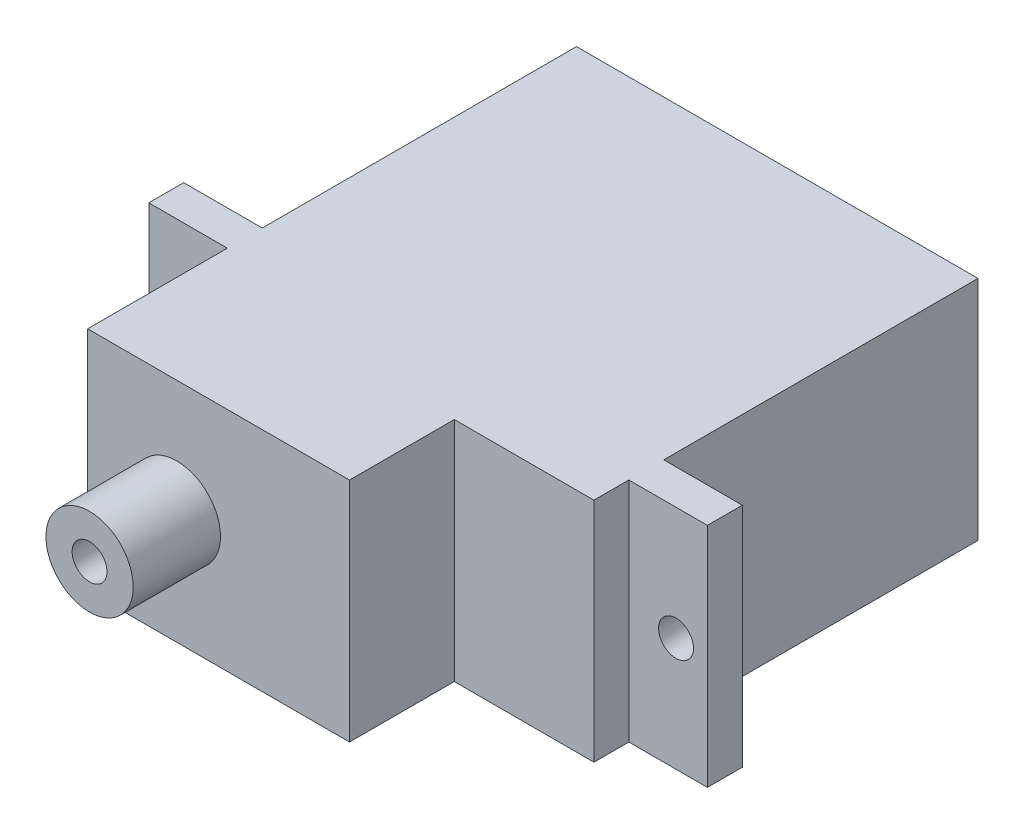
ISO-10303-21;
HEADER;
FILE_DESCRIPTION(('STEP AP214'),'2;1');
FILE_NAME('part.step','',(''),(''),'','','');
FILE_SCHEMA(('AUTOMOTIVE_DESIGN { 1 0 10303 214 1 1 1 1 }'));
ENDSEC;
DATA;
#1=APPLICATION_CONTEXT('core data for automotive mechanical design processes');
#2=APPLICATION_PROTOCOL_DEFINITION('international standard','automotive_design',2000,#1);
#3=PRODUCT_CONTEXT('',#1,'mechanical');
#4=PRODUCT('Part','Part','',(#3));
#5=PRODUCT_RELATED_PRODUCT_CATEGORY('part','',(#4));
#6=PRODUCT_DEFINITION_FORMATION('','',#4);
#7=PRODUCT_DEFINITION_CONTEXT('part definition',#1,'design');
#8=PRODUCT_DEFINITION('design','',#6,#7);
#9=PRODUCT_DEFINITION_SHAPE('','',#8);
#10=(LENGTH_UNIT() NAMED_UNIT(*) SI_UNIT(.MILLI.,.METRE.));
#11=(NAMED_UNIT(*) PLANE_ANGLE_UNIT() SI_UNIT($,.RADIAN.));
#12=(NAMED_UNIT(*) SI_UNIT($,.STERADIAN.) SOLID_ANGLE_UNIT());
#13=UNCERTAINTY_MEASURE_WITH_UNIT(LENGTH_MEASURE(1.E-05),#10,'distance_accuracy_value','');
#14=(GEOMETRIC_REPRESENTATION_CONTEXT(3) GLOBAL_UNCERTAINTY_ASSIGNED_CONTEXT((#13)) GLOBAL_UNIT_ASSIGNED_CONTEXT((#10,
#11,#12)) REPRESENTATION_CONTEXT('',''));
#15=CARTESIAN_POINT('',(0.,0.,0.));
#16=DIRECTION('',(0.,0.,1.));
#17=DIRECTION('',(1.,0.,0.));
#18=AXIS2_PLACEMENT_3D('',#15,#16,#17);
#19=CARTESIAN_POINT('',(0.,0.,20.));
#20=DIRECTION('',(0.,0.,1.));
#21=DIRECTION('',(1.,0.,0.));
#22=AXIS2_PLACEMENT_3D('',#19,#20,#21);
#23=PLANE('',#22);
#24=CARTESIAN_POINT('',(14.2018791837017,0.,20.));
#25=DIRECTION('',(0.,0.,1.));
#26=DIRECTION('',(1.,0.,0.));
#27=AXIS2_PLACEMENT_3D('',#24,#25,#26);
#28=CIRCLE('',#27,1.);
#29=CARTESIAN_POINT('',(15.2018791837017,0.,20.));
#30=VERTEX_POINT('',#29);
#31=EDGE_CURVE('E312',#30,#30,#28,.T.);
#32=ORIENTED_EDGE('',*,*,#31,.F.);
#33=EDGE_LOOP('',(#32));
#34=FACE_BOUND('',#33,.T.);
#35=DIRECTION('',(0.,1.,0.));
#36=VECTOR('',#35,1.);
#37=CARTESIAN_POINT('',(11.5,6.5,20.));
#38=LINE('',#37,#36);
#39=CARTESIAN_POINT('',(11.5,-6.5,20.));
#40=VERTEX_POINT('',#39);
#41=CARTESIAN_POINT('',(11.5,6.5,20.));
#42=VERTEX_POINT('',#41);
#43=EDGE_CURVE('E59',#40,#42,#38,.T.);
#44=ORIENTED_EDGE('',*,*,#43,.F.);
#45=DIRECTION('',(1.,0.,0.));
#46=VECTOR('',#45,1.);
#47=CARTESIAN_POINT('',(-16.,-6.5,20.));
#48=LINE('',#47,#46);
#49=CARTESIAN_POINT('',(16.,-6.5,20.));
#50=VERTEX_POINT('',#49);
#51=EDGE_CURVE('E199',#40,#50,#48,.T.);
#52=ORIENTED_EDGE('',*,*,#51,.T.);
#53=DIRECTION('',(0.,1.,0.));
#54=VECTOR('',#53,1.);
#55=CARTESIAN_POINT('',(16.,6.5,20.));
#56=LINE('',#55,#54);
#57=CARTESIAN_POINT('',(16.,6.5,20.));
#58=VERTEX_POINT('',#57);
#59=EDGE_CURVE('E190',#50,#58,#56,.T.);
#60=ORIENTED_EDGE('',*,*,#59,.T.);
#61=DIRECTION('',(-1.,0.,0.));
#62=VECTOR('',#61,1.);
#63=CARTESIAN_POINT('',(-16.,6.5,20.));
#64=LINE('',#63,#62);
#65=EDGE_CURVE('E195',#58,#42,#64,.T.);
#66=ORIENTED_EDGE('',*,*,#65,.T.);
#67=EDGE_LOOP('',(#44,#52,#60,#66));
#68=FACE_BOUND('',#67,.T.);
#69=ADVANCED_FACE('F34',(#34,#68),#23,.T.);
#70=CARTESIAN_POINT('',(11.5,6.5,18.));
#71=DIRECTION('',(-1.,0.,0.));
#72=DIRECTION('',(0.,-1.,0.));
#73=AXIS2_PLACEMENT_3D('',#70,#71,#72);
#74=PLANE('',#73);
#75=DIRECTION('',(0.,1.,0.));
#76=VECTOR('',#75,1.);
#77=CARTESIAN_POINT('',(11.5,6.5,0.));
#78=LINE('',#77,#76);
#79=CARTESIAN_POINT('',(11.5,-6.5,0.));
#80=VERTEX_POINT('',#79);
#81=CARTESIAN_POINT('',(11.5,6.5,0.));
#82=VERTEX_POINT('',#81);
#83=EDGE_CURVE('E225',#80,#82,#78,.T.);
#84=ORIENTED_EDGE('',*,*,#83,.T.);
#85=DIRECTION('',(0.,0.,-1.));
#86=VECTOR('',#85,1.);
#87=CARTESIAN_POINT('',(11.5,6.5,18.));
#88=LINE('',#87,#86);
#89=CARTESIAN_POINT('',(11.5,6.5,18.));
#90=VERTEX_POINT('',#89);
#91=EDGE_CURVE('E43',#90,#82,#88,.T.);
#92=ORIENTED_EDGE('',*,*,#91,.F.);
#93=DIRECTION('',(0.,1.,0.));
#94=VECTOR('',#93,1.);
#95=CARTESIAN_POINT('',(11.5,6.5,18.));
#96=LINE('',#95,#94);
#97=CARTESIAN_POINT('',(11.5,-6.5,18.));
#98=VERTEX_POINT('',#97);
#99=EDGE_CURVE('E226',#98,#90,#96,.T.);
#100=ORIENTED_EDGE('',*,*,#99,.F.);
#101=DIRECTION('',(0.,0.,-1.));
#102=VECTOR('',#101,1.);
#103=CARTESIAN_POINT('',(11.5,-6.5,18.));
#104=LINE('',#103,#102);
#105=EDGE_CURVE('E233',#98,#80,#104,.T.);
#106=ORIENTED_EDGE('',*,*,#105,.T.);
#107=EDGE_LOOP('',(#84,#92,#100,#106));
#108=FACE_BOUND('',#107,.T.);
#109=ADVANCED_FACE('F36',(#108),#74,.F.);
#110=CARTESIAN_POINT('',(-11.5,6.5,18.));
#111=DIRECTION('',(0.,-1.,0.));
#112=DIRECTION('',(0.,0.,-1.));
#113=AXIS2_PLACEMENT_3D('',#110,#111,#112);
#114=PLANE('',#113);
#115=DIRECTION('',(-1.,0.,0.));
#116=VECTOR('',#115,1.);
#117=CARTESIAN_POINT('',(-11.5,6.5,0.));
#118=LINE('',#117,#116);
#119=CARTESIAN_POINT('',(-11.5,6.5,0.));
#120=VERTEX_POINT('',#119);
#121=EDGE_CURVE('E236',#82,#120,#118,.T.);
#122=ORIENTED_EDGE('',*,*,#121,.T.);
#123=DIRECTION('',(0.,0.,-1.));
#124=VECTOR('',#123,1.);
#125=CARTESIAN_POINT('',(-11.5,6.5,18.));
#126=LINE('',#125,#124);
#127=CARTESIAN_POINT('',(-11.5,6.5,18.));
#128=VERTEX_POINT('',#127);
#129=EDGE_CURVE('E246',#128,#120,#126,.T.);
#130=ORIENTED_EDGE('',*,*,#129,.F.);
#131=DIRECTION('',(-1.,0.,0.));
#132=VECTOR('',#131,1.);
#133=CARTESIAN_POINT('',(-16.,6.5,18.));
#134=LINE('',#133,#132);
#135=CARTESIAN_POINT('',(-16.,6.5,18.));
#136=VERTEX_POINT('',#135);
#137=EDGE_CURVE('E205',#128,#136,#134,.T.);
#138=ORIENTED_EDGE('',*,*,#137,.T.);
#139=DIRECTION('',(0.,0.,-1.));
#140=VECTOR('',#139,1.);
#141=CARTESIAN_POINT('',(-16.,6.5,20.));
#142=LINE('',#141,#140);
#143=CARTESIAN_POINT('',(-16.,6.5,20.));
#144=VERTEX_POINT('',#143);
#145=EDGE_CURVE('E219',#144,#136,#142,.T.);
#146=ORIENTED_EDGE('',*,*,#145,.F.);
#147=CARTESIAN_POINT('',(-11.5,6.5,20.));
#148=VERTEX_POINT('',#147);
#149=EDGE_CURVE('E193',#148,#144,#64,.T.);
#150=ORIENTED_EDGE('',*,*,#149,.F.);
#151=DIRECTION('',(0.,0.,-1.));
#152=VECTOR('',#151,1.);
#153=CARTESIAN_POINT('',(-11.5,6.5,22.));
#154=LINE('',#153,#152);
#155=CARTESIAN_POINT('',(-11.5,6.5,28.));
#156=VERTEX_POINT('',#155);
#157=EDGE_CURVE('E147',#156,#148,#154,.T.);
#158=ORIENTED_EDGE('',*,*,#157,.F.);
#159=DIRECTION('',(-1.,0.,0.));
#160=VECTOR('',#159,1.);
#161=CARTESIAN_POINT('',(-11.5,6.5,28.));
#162=LINE('',#161,#160);
#163=CARTESIAN_POINT('',(3.5,6.5,28.));
#164=VERTEX_POINT('',#163);
#165=EDGE_CURVE('E162',#164,#156,#162,.T.);
#166=ORIENTED_EDGE('',*,*,#165,.F.);
#167=DIRECTION('',(0.,0.,-1.));
#168=VECTOR('',#167,1.);
#169=CARTESIAN_POINT('',(3.5,6.5,28.));
#170=LINE('',#169,#168);
#171=CARTESIAN_POINT('',(3.5,6.5,22.));
#172=VERTEX_POINT('',#171);
#173=EDGE_CURVE('E169',#164,#172,#170,.T.);
#174=ORIENTED_EDGE('',*,*,#173,.T.);
#175=DIRECTION('',(-1.,0.,0.));
#176=VECTOR('',#175,1.);
#177=CARTESIAN_POINT('',(-11.5,6.5,22.));
#178=LINE('',#177,#176);
#179=CARTESIAN_POINT('',(11.5,6.5,22.));
#180=VERTEX_POINT('',#179);
#181=EDGE_CURVE('E177',#180,#172,#178,.T.);
#182=ORIENTED_EDGE('',*,*,#181,.F.);
#183=DIRECTION('',(0.,0.,-1.));
#184=VECTOR('',#183,1.);
#185=CARTESIAN_POINT('',(11.5,6.5,22.));
#186=LINE('',#185,#184);
#187=EDGE_CURVE('E186',#180,#42,#186,.T.);
#188=ORIENTED_EDGE('',*,*,#187,.T.);
#189=ORIENTED_EDGE('',*,*,#65,.F.);
#190=DIRECTION('',(0.,0.,-1.));
#191=VECTOR('',#190,1.);
#192=CARTESIAN_POINT('',(16.,6.5,20.));
#193=LINE('',#192,#191);
#194=CARTESIAN_POINT('',(16.,6.5,18.));
#195=VERTEX_POINT('',#194);
#196=EDGE_CURVE('E222',#58,#195,#193,.T.);
#197=ORIENTED_EDGE('',*,*,#196,.T.);
#198=EDGE_CURVE('E206',#195,#90,#134,.T.);
#199=ORIENTED_EDGE('',*,*,#198,.T.);
#200=ORIENTED_EDGE('',*,*,#91,.T.);
#201=EDGE_LOOP('',(#122,#130,#138,#146,#150,#158,#166,#174,#182,#188,#189,#197,#199,#200));
#202=FACE_BOUND('',#201,.T.);
#203=ADVANCED_FACE('F250',(#202),#114,.F.);
#204=CARTESIAN_POINT('',(-11.5,6.5,18.));
#205=DIRECTION('',(1.,0.,0.));
#206=DIRECTION('',(0.,1.,0.));
#207=AXIS2_PLACEMENT_3D('',#204,#205,#206);
#208=PLANE('',#207);
#209=DIRECTION('',(0.,-1.,0.));
#210=VECTOR('',#209,1.);
#211=CARTESIAN_POINT('',(-11.5,6.5,0.));
#212=LINE('',#211,#210);
#213=CARTESIAN_POINT('',(-11.5,-6.5,0.));
#214=VERTEX_POINT('',#213);
#215=EDGE_CURVE('E238',#120,#214,#212,.T.);
#216=ORIENTED_EDGE('',*,*,#215,.T.);
#217=DIRECTION('',(0.,0.,-1.));
#218=VECTOR('',#217,1.);
#219=CARTESIAN_POINT('',(-11.5,-6.5,18.));
#220=LINE('',#219,#218);
#221=CARTESIAN_POINT('',(-11.5,-6.5,18.));
#222=VERTEX_POINT('',#221);
#223=EDGE_CURVE('E243',#222,#214,#220,.T.);
#224=ORIENTED_EDGE('',*,*,#223,.F.);
#225=DIRECTION('',(0.,-1.,0.));
#226=VECTOR('',#225,1.);
#227=CARTESIAN_POINT('',(-11.5,6.5,18.));
#228=LINE('',#227,#226);
#229=EDGE_CURVE('E229',#128,#222,#228,.T.);
#230=ORIENTED_EDGE('',*,*,#229,.F.);
#231=ORIENTED_EDGE('',*,*,#129,.T.);
#232=EDGE_LOOP('',(#216,#224,#230,#231));
#233=FACE_BOUND('',#232,.T.);
#234=ADVANCED_FACE('F259',(#233),#208,.F.);
#235=CARTESIAN_POINT('',(-11.5,-6.5,18.));
#236=DIRECTION('',(0.,1.,0.));
#237=DIRECTION('',(0.,0.,1.));
#238=AXIS2_PLACEMENT_3D('',#235,#236,#237);
#239=PLANE('',#238);
#240=DIRECTION('',(1.,0.,0.));
#241=VECTOR('',#240,1.);
#242=CARTESIAN_POINT('',(-11.5,-6.5,0.));
#243=LINE('',#242,#241);
#244=EDGE_CURVE('E230',#214,#80,#243,.T.);
#245=ORIENTED_EDGE('',*,*,#244,.T.);
#246=ORIENTED_EDGE('',*,*,#105,.F.);
#247=DIRECTION('',(1.,0.,0.));
#248=VECTOR('',#247,1.);
#249=CARTESIAN_POINT('',(-16.,-6.5,18.));
#250=LINE('',#249,#248);
#251=CARTESIAN_POINT('',(16.,-6.5,18.));
#252=VERTEX_POINT('',#251);
#253=EDGE_CURVE('E211',#98,#252,#250,.T.);
#254=ORIENTED_EDGE('',*,*,#253,.T.);
#255=DIRECTION('',(0.,0.,-1.));
#256=VECTOR('',#255,1.);
#257=CARTESIAN_POINT('',(16.,-6.5,20.));
#258=LINE('',#257,#256);
#259=EDGE_CURVE('E202',#50,#252,#258,.T.);
#260=ORIENTED_EDGE('',*,*,#259,.F.);
#261=ORIENTED_EDGE('',*,*,#51,.F.);
#262=DIRECTION('',(0.,0.,-1.));
#263=VECTOR('',#262,1.);
#264=CARTESIAN_POINT('',(11.5,-6.5,22.));
#265=LINE('',#264,#263);
#266=CARTESIAN_POINT('',(11.5,-6.5,22.));
#267=VERTEX_POINT('',#266);
#268=EDGE_CURVE('E148',#267,#40,#265,.T.);
#269=ORIENTED_EDGE('',*,*,#268,.F.);
#270=DIRECTION('',(1.,0.,0.));
#271=VECTOR('',#270,1.);
#272=CARTESIAN_POINT('',(-11.5,-6.5,22.));
#273=LINE('',#272,#271);
#274=CARTESIAN_POINT('',(3.5,-6.5,22.));
#275=VERTEX_POINT('',#274);
#276=EDGE_CURVE('E179',#275,#267,#273,.T.);
#277=ORIENTED_EDGE('',*,*,#276,.F.);
#278=DIRECTION('',(0.,0.,-1.));
#279=VECTOR('',#278,1.);
#280=CARTESIAN_POINT('',(3.5,-6.5,28.));
#281=LINE('',#280,#279);
#282=CARTESIAN_POINT('',(3.5,-6.5,28.));
#283=VERTEX_POINT('',#282);
#284=EDGE_CURVE('E154',#283,#275,#281,.T.);
#285=ORIENTED_EDGE('',*,*,#284,.F.);
#286=DIRECTION('',(1.,0.,0.));
#287=VECTOR('',#286,1.);
#288=CARTESIAN_POINT('',(-11.5,-6.5,28.));
#289=LINE('',#288,#287);
#290=CARTESIAN_POINT('',(-11.5,-6.5,28.));
#291=VERTEX_POINT('',#290);
#292=EDGE_CURVE('E151',#291,#283,#289,.T.);
#293=ORIENTED_EDGE('',*,*,#292,.F.);
#294=DIRECTION('',(0.,0.,-1.));
#295=VECTOR('',#294,1.);
#296=CARTESIAN_POINT('',(-11.5,-6.5,22.));
#297=LINE('',#296,#295);
#298=CARTESIAN_POINT('',(-11.5,-6.5,20.));
#299=VERTEX_POINT('',#298);
#300=EDGE_CURVE('E138',#291,#299,#297,.T.);
#301=ORIENTED_EDGE('',*,*,#300,.T.);
#302=CARTESIAN_POINT('',(-16.,-6.5,20.));
#303=VERTEX_POINT('',#302);
#304=EDGE_CURVE('E200',#303,#299,#48,.T.);
#305=ORIENTED_EDGE('',*,*,#304,.F.);
#306=DIRECTION('',(0.,0.,-1.));
#307=VECTOR('',#306,1.);
#308=CARTESIAN_POINT('',(-16.,-6.5,20.));
#309=LINE('',#308,#307);
#310=CARTESIAN_POINT('',(-16.,-6.5,18.));
#311=VERTEX_POINT('',#310);
#312=EDGE_CURVE('E216',#303,#311,#309,.T.);
#313=ORIENTED_EDGE('',*,*,#312,.T.);
#314=EDGE_CURVE('E194',#311,#222,#250,.T.);
#315=ORIENTED_EDGE('',*,*,#314,.T.);
#316=ORIENTED_EDGE('',*,*,#223,.T.);
#317=EDGE_LOOP('',(#245,#246,#254,#260,#261,#269,#277,#285,#293,#301,#305,#313,#315,#316));
#318=FACE_BOUND('',#317,.T.);
#319=ADVANCED_FACE('F152',(#318),#239,.F.);
#320=CARTESIAN_POINT('',(0.,0.,0.));
#321=DIRECTION('',(0.,0.,1.));
#322=DIRECTION('',(1.,0.,0.));
#323=AXIS2_PLACEMENT_3D('',#320,#321,#322);
#324=PLANE('',#323);
#325=ORIENTED_EDGE('',*,*,#83,.F.);
#326=ORIENTED_EDGE('',*,*,#244,.F.);
#327=ORIENTED_EDGE('',*,*,#215,.F.);
#328=ORIENTED_EDGE('',*,*,#121,.F.);
#329=EDGE_LOOP('',(#325,#326,#327,#328));
#330=FACE_BOUND('',#329,.T.);
#331=ADVANCED_FACE('F256',(#330),#324,.F.);
#332=CARTESIAN_POINT('',(0.,0.,18.));
#333=DIRECTION('',(0.,0.,1.));
#334=DIRECTION('',(1.,0.,0.));
#335=AXIS2_PLACEMENT_3D('',#332,#333,#334);
#336=PLANE('',#335);
#337=CARTESIAN_POINT('',(14.2018791837017,0.,18.));
#338=DIRECTION('',(0.,0.,1.));
#339=DIRECTION('',(1.,0.,0.));
#340=AXIS2_PLACEMENT_3D('',#337,#338,#339);
#341=CIRCLE('',#340,1.);
#342=CARTESIAN_POINT('',(15.2018791837017,0.,18.));
#343=VERTEX_POINT('',#342);
#344=EDGE_CURVE('E38',#343,#343,#341,.T.);
#345=ORIENTED_EDGE('',*,*,#344,.T.);
#346=EDGE_LOOP('',(#345));
#347=FACE_BOUND('',#346,.T.);
#348=ORIENTED_EDGE('',*,*,#253,.F.);
#349=ORIENTED_EDGE('',*,*,#99,.T.);
#350=ORIENTED_EDGE('',*,*,#198,.F.);
#351=DIRECTION('',(0.,1.,0.));
#352=VECTOR('',#351,1.);
#353=CARTESIAN_POINT('',(16.,6.5,18.));
#354=LINE('',#353,#352);
#355=EDGE_CURVE('E189',#252,#195,#354,.T.);
#356=ORIENTED_EDGE('',*,*,#355,.F.);
#357=EDGE_LOOP('',(#348,#349,#350,#356));
#358=FACE_BOUND('',#357,.T.);
#359=ADVANCED_FACE('F359',(#347,#358),#336,.F.);
#360=CARTESIAN_POINT('',(-13.6890616233174,0.,18.));
#361=DIRECTION('',(0.,0.,1.));
#362=DIRECTION('',(1.,0.,0.));
#363=AXIS2_PLACEMENT_3D('',#360,#361,#362);
#364=CIRCLE('',#363,1.);
#365=CARTESIAN_POINT('',(-12.6890616233174,0.,18.));
#366=VERTEX_POINT('',#365);
#367=EDGE_CURVE('E311',#366,#366,#364,.T.);
#368=ORIENTED_EDGE('',*,*,#367,.T.);
#369=EDGE_LOOP('',(#368));
#370=FACE_BOUND('',#369,.T.);
#371=ORIENTED_EDGE('',*,*,#137,.F.);
#372=ORIENTED_EDGE('',*,*,#229,.T.);
#373=ORIENTED_EDGE('',*,*,#314,.F.);
#374=DIRECTION('',(0.,-1.,0.));
#375=VECTOR('',#374,1.);
#376=CARTESIAN_POINT('',(-16.,6.5,18.));
#377=LINE('',#376,#375);
#378=EDGE_CURVE('E209',#136,#311,#377,.T.);
#379=ORIENTED_EDGE('',*,*,#378,.F.);
#380=EDGE_LOOP('',(#371,#372,#373,#379));
#381=FACE_BOUND('',#380,.T.);
#382=ADVANCED_FACE('F266',(#370,#381),#336,.F.);
#383=CARTESIAN_POINT('',(16.,6.5,20.));
#384=DIRECTION('',(-1.,0.,0.));
#385=DIRECTION('',(0.,0.,1.));
#386=AXIS2_PLACEMENT_3D('',#383,#384,#385);
#387=PLANE('',#386);
#388=ORIENTED_EDGE('',*,*,#355,.T.);
#389=ORIENTED_EDGE('',*,*,#196,.F.);
#390=ORIENTED_EDGE('',*,*,#59,.F.);
#391=ORIENTED_EDGE('',*,*,#259,.T.);
#392=EDGE_LOOP('',(#388,#389,#390,#391));
#393=FACE_BOUND('',#392,.T.);
#394=ADVANCED_FACE('F305',(#393),#387,.F.);
#395=CARTESIAN_POINT('',(-16.,6.5,20.));
#396=DIRECTION('',(1.,0.,0.));
#397=DIRECTION('',(0.,0.,-1.));
#398=AXIS2_PLACEMENT_3D('',#395,#396,#397);
#399=PLANE('',#398);
#400=ORIENTED_EDGE('',*,*,#378,.T.);
#401=ORIENTED_EDGE('',*,*,#312,.F.);
#402=DIRECTION('',(0.,-1.,0.));
#403=VECTOR('',#402,1.);
#404=CARTESIAN_POINT('',(-16.,6.5,20.));
#405=LINE('',#404,#403);
#406=EDGE_CURVE('E197',#144,#303,#405,.T.);
#407=ORIENTED_EDGE('',*,*,#406,.F.);
#408=ORIENTED_EDGE('',*,*,#145,.T.);
#409=EDGE_LOOP('',(#400,#401,#407,#408));
#410=FACE_BOUND('',#409,.T.);
#411=ADVANCED_FACE('F271',(#410),#399,.F.);
#412=CARTESIAN_POINT('',(-13.6890616233174,0.,20.));
#413=DIRECTION('',(0.,0.,1.));
#414=DIRECTION('',(1.,0.,0.));
#415=AXIS2_PLACEMENT_3D('',#412,#413,#414);
#416=CIRCLE('',#415,1.);
#417=CARTESIAN_POINT('',(-12.6890616233174,0.,20.));
#418=VERTEX_POINT('',#417);
#419=EDGE_CURVE('E309',#418,#418,#416,.T.);
#420=ORIENTED_EDGE('',*,*,#419,.F.);
#421=EDGE_LOOP('',(#420));
#422=FACE_BOUND('',#421,.T.);
#423=DIRECTION('',(0.,-1.,0.));
#424=VECTOR('',#423,1.);
#425=CARTESIAN_POINT('',(-11.5,6.5,20.));
#426=LINE('',#425,#424);
#427=EDGE_CURVE('E144',#148,#299,#426,.T.);
#428=ORIENTED_EDGE('',*,*,#427,.F.);
#429=ORIENTED_EDGE('',*,*,#149,.T.);
#430=ORIENTED_EDGE('',*,*,#406,.T.);
#431=ORIENTED_EDGE('',*,*,#304,.T.);
#432=EDGE_LOOP('',(#428,#429,#430,#431));
#433=FACE_BOUND('',#432,.T.);
#434=ADVANCED_FACE('F273',(#422,#433),#23,.T.);
#435=CARTESIAN_POINT('',(11.5,6.5,22.));
#436=DIRECTION('',(-1.,0.,0.));
#437=DIRECTION('',(0.,0.,1.));
#438=AXIS2_PLACEMENT_3D('',#435,#436,#437);
#439=PLANE('',#438);
#440=ORIENTED_EDGE('',*,*,#43,.T.);
#441=ORIENTED_EDGE('',*,*,#187,.F.);
#442=DIRECTION('',(0.,1.,0.));
#443=VECTOR('',#442,1.);
#444=CARTESIAN_POINT('',(11.5,6.5,22.));
#445=LINE('',#444,#443);
#446=EDGE_CURVE('E174',#267,#180,#445,.T.);
#447=ORIENTED_EDGE('',*,*,#446,.F.);
#448=ORIENTED_EDGE('',*,*,#268,.T.);
#449=EDGE_LOOP('',(#440,#441,#447,#448));
#450=FACE_BOUND('',#449,.T.);
#451=ADVANCED_FACE('F298',(#450),#439,.F.);
#452=CARTESIAN_POINT('',(-11.5,6.5,22.));
#453=DIRECTION('',(1.,0.,0.));
#454=DIRECTION('',(0.,0.,-1.));
#455=AXIS2_PLACEMENT_3D('',#452,#453,#454);
#456=PLANE('',#455);
#457=ORIENTED_EDGE('',*,*,#427,.T.);
#458=ORIENTED_EDGE('',*,*,#300,.F.);
#459=DIRECTION('',(0.,-1.,0.));
#460=VECTOR('',#459,1.);
#461=CARTESIAN_POINT('',(-11.5,-6.5,28.));
#462=LINE('',#461,#460);
#463=EDGE_CURVE('E143',#156,#291,#462,.T.);
#464=ORIENTED_EDGE('',*,*,#463,.F.);
#465=ORIENTED_EDGE('',*,*,#157,.T.);
#466=EDGE_LOOP('',(#457,#458,#464,#465));
#467=FACE_BOUND('',#466,.T.);
#468=ADVANCED_FACE('F140',(#467),#456,.F.);
#469=CARTESIAN_POINT('',(0.,0.,22.));
#470=DIRECTION('',(0.,0.,1.));
#471=DIRECTION('',(1.,0.,0.));
#472=AXIS2_PLACEMENT_3D('',#469,#470,#471);
#473=PLANE('',#472);
#474=DIRECTION('',(0.,1.,0.));
#475=VECTOR('',#474,1.);
#476=CARTESIAN_POINT('',(3.5,-6.5,22.));
#477=LINE('',#476,#475);
#478=EDGE_CURVE('E51',#275,#172,#477,.T.);
#479=ORIENTED_EDGE('',*,*,#478,.F.);
#480=ORIENTED_EDGE('',*,*,#276,.T.);
#481=ORIENTED_EDGE('',*,*,#446,.T.);
#482=ORIENTED_EDGE('',*,*,#181,.T.);
#483=EDGE_LOOP('',(#479,#480,#481,#482));
#484=FACE_BOUND('',#483,.T.);
#485=ADVANCED_FACE('F278',(#484),#473,.T.);
#486=CARTESIAN_POINT('',(3.5,-6.5,28.));
#487=DIRECTION('',(-1.,0.,0.));
#488=DIRECTION('',(0.,0.,1.));
#489=AXIS2_PLACEMENT_3D('',#486,#487,#488);
#490=PLANE('',#489);
#491=ORIENTED_EDGE('',*,*,#478,.T.);
#492=ORIENTED_EDGE('',*,*,#173,.F.);
#493=DIRECTION('',(0.,1.,0.));
#494=VECTOR('',#493,1.);
#495=CARTESIAN_POINT('',(3.5,-6.5,28.));
#496=LINE('',#495,#494);
#497=EDGE_CURVE('E157',#283,#164,#496,.T.);
#498=ORIENTED_EDGE('',*,*,#497,.F.);
#499=ORIENTED_EDGE('',*,*,#284,.T.);
#500=EDGE_LOOP('',(#491,#492,#498,#499));
#501=FACE_BOUND('',#500,.T.);
#502=ADVANCED_FACE('F276',(#501),#490,.F.);
#503=CARTESIAN_POINT('',(0.,0.,28.));
#504=DIRECTION('',(0.,0.,-1.));
#505=DIRECTION('',(-1.,0.,0.));
#506=AXIS2_PLACEMENT_3D('',#503,#504,#505);
#507=PLANE('',#506);
#508=CARTESIAN_POINT('',(-6.39150961202459,0.,28.));
#509=DIRECTION('',(0.,0.,1.));
#510=DIRECTION('',(1.,0.,0.));
#511=AXIS2_PLACEMENT_3D('',#508,#509,#510);
#512=CIRCLE('',#511,2.5);
#513=CARTESIAN_POINT('',(-3.89150961202459,0.,28.));
#514=VERTEX_POINT('',#513);
#515=EDGE_CURVE('E11',#514,#514,#512,.T.);
#516=ORIENTED_EDGE('',*,*,#515,.F.);
#517=EDGE_LOOP('',(#516));
#518=FACE_BOUND('',#517,.T.);
#519=ORIENTED_EDGE('',*,*,#463,.T.);
#520=ORIENTED_EDGE('',*,*,#292,.T.);
#521=ORIENTED_EDGE('',*,*,#497,.T.);
#522=ORIENTED_EDGE('',*,*,#165,.T.);
#523=EDGE_LOOP('',(#519,#520,#521,#522));
#524=FACE_BOUND('',#523,.T.);
#525=ADVANCED_FACE('F160',(#518,#524),#507,.F.);
#526=CARTESIAN_POINT('',(-6.39150961202459,0.,33.));
#527=DIRECTION('',(0.,0.,-1.));
#528=DIRECTION('',(-1.,0.,0.));
#529=AXIS2_PLACEMENT_3D('',#526,#527,#528);
#530=CYLINDRICAL_SURFACE('',#529,2.5);
#531=CARTESIAN_POINT('',(-6.39150961202459,0.,33.));
#532=DIRECTION('',(0.,0.,1.));
#533=DIRECTION('',(1.,0.,0.));
#534=AXIS2_PLACEMENT_3D('',#531,#532,#533);
#535=CIRCLE('',#534,2.5);
#536=CARTESIAN_POINT('',(-3.89150961202459,0.,33.));
#537=VERTEX_POINT('',#536);
#538=EDGE_CURVE('E164',#537,#537,#535,.T.);
#539=ORIENTED_EDGE('',*,*,#538,.F.);
#540=EDGE_LOOP('',(#539));
#541=FACE_BOUND('',#540,.T.);
#542=ORIENTED_EDGE('',*,*,#515,.T.);
#543=EDGE_LOOP('',(#542));
#544=FACE_BOUND('',#543,.T.);
#545=ADVANCED_FACE('F284',(#541,#544),#530,.T.);
#546=CARTESIAN_POINT('',(-6.39150961202459,0.,33.));
#547=DIRECTION('',(0.,0.,1.));
#548=DIRECTION('',(1.,0.,0.));
#549=AXIS2_PLACEMENT_3D('',#546,#547,#548);
#550=PLANE('',#549);
#551=CARTESIAN_POINT('',(-6.39150961202459,0.,33.));
#552=DIRECTION('',(0.,0.,1.));
#553=DIRECTION('',(1.,0.,0.));
#554=AXIS2_PLACEMENT_3D('',#551,#552,#553);
#555=CIRCLE('',#554,1.);
#556=CARTESIAN_POINT('',(-5.39150961202459,0.,33.));
#557=VERTEX_POINT('',#556);
#558=EDGE_CURVE('E322',#557,#557,#555,.T.);
#559=ORIENTED_EDGE('',*,*,#558,.F.);
#560=EDGE_LOOP('',(#559));
#561=FACE_BOUND('',#560,.T.);
#562=ORIENTED_EDGE('',*,*,#538,.T.);
#563=EDGE_LOOP('',(#562));
#564=FACE_BOUND('',#563,.T.);
#565=ADVANCED_FACE('F327',(#561,#564),#550,.T.);
#566=CARTESIAN_POINT('',(-6.39150961202459,0.,28.));
#567=DIRECTION('',(0.,0.,1.));
#568=DIRECTION('',(1.,0.,0.));
#569=AXIS2_PLACEMENT_3D('',#566,#567,#568);
#570=CYLINDRICAL_SURFACE('',#569,1.);
#571=CARTESIAN_POINT('',(-6.39150961202459,0.,28.));
#572=DIRECTION('',(0.,0.,1.));
#573=DIRECTION('',(1.,0.,0.));
#574=AXIS2_PLACEMENT_3D('',#571,#572,#573);
#575=CIRCLE('',#574,1.);
#576=CARTESIAN_POINT('',(-5.39150961202459,0.,28.));
#577=VERTEX_POINT('',#576);
#578=EDGE_CURVE('E319',#577,#577,#575,.T.);
#579=ORIENTED_EDGE('',*,*,#578,.F.);
#580=EDGE_LOOP('',(#579));
#581=FACE_BOUND('',#580,.T.);
#582=ORIENTED_EDGE('',*,*,#558,.T.);
#583=EDGE_LOOP('',(#582));
#584=FACE_BOUND('',#583,.T.);
#585=ADVANCED_FACE('F336',(#581,#584),#570,.F.);
#586=CARTESIAN_POINT('',(-6.39150961202459,0.,28.));
#587=DIRECTION('',(0.,0.,1.));
#588=DIRECTION('',(1.,0.,0.));
#589=AXIS2_PLACEMENT_3D('',#586,#587,#588);
#590=PLANE('',#589);
#591=ORIENTED_EDGE('',*,*,#578,.T.);
#592=EDGE_LOOP('',(#591));
#593=FACE_BOUND('',#592,.T.);
#594=ADVANCED_FACE('F342',(#593),#590,.T.);
#595=CARTESIAN_POINT('',(-13.6890616233174,0.,15.));
#596=DIRECTION('',(0.,0.,1.));
#597=DIRECTION('',(1.,0.,0.));
#598=AXIS2_PLACEMENT_3D('',#595,#596,#597);
#599=CYLINDRICAL_SURFACE('',#598,1.);
#600=ORIENTED_EDGE('',*,*,#419,.T.);
#601=EDGE_LOOP('',(#600));
#602=FACE_BOUND('',#601,.T.);
#603=ORIENTED_EDGE('',*,*,#367,.F.);
#604=EDGE_LOOP('',(#603));
#605=FACE_BOUND('',#604,.T.);
#606=ADVANCED_FACE('F346',(#602,#605),#599,.F.);
#607=CARTESIAN_POINT('',(14.2018791837017,0.,15.));
#608=DIRECTION('',(0.,0.,1.));
#609=DIRECTION('',(1.,0.,0.));
#610=AXIS2_PLACEMENT_3D('',#607,#608,#609);
#611=CYLINDRICAL_SURFACE('',#610,1.);
#612=ORIENTED_EDGE('',*,*,#31,.T.);
#613=EDGE_LOOP('',(#612));
#614=FACE_BOUND('',#613,.T.);
#615=ORIENTED_EDGE('',*,*,#344,.F.);
#616=EDGE_LOOP('',(#615));
#617=FACE_BOUND('',#616,.T.);
#618=ADVANCED_FACE('F348',(#614,#617),#611,.F.);
#619=CLOSED_SHELL('',(#69,#109,#203,#234,#319,#331,#359,#382,#394,#411,#434,#451,#468,#485,#502,
#525,#545,#565,#585,#594,#606,#618));
#620=MANIFOLD_SOLID_BREP('B2',#619);
#621=ADVANCED_BREP_SHAPE_REPRESENTATION('',(#18,#620),#14);
#622=SHAPE_DEFINITION_REPRESENTATION(#9,#621);
ENDSEC;
END-ISO-10303-21;
